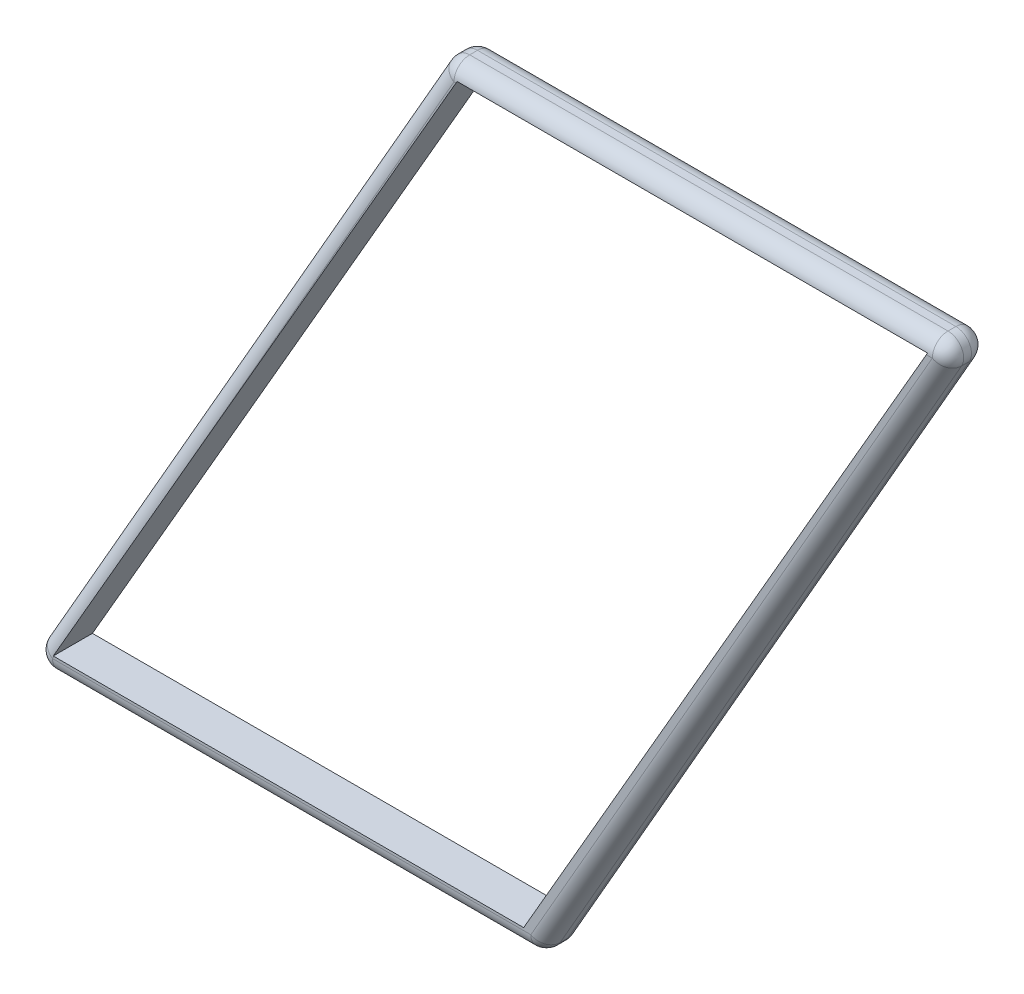
ISO-10303-21;
HEADER;
FILE_DESCRIPTION(('STEP AP214'),'2;1');
FILE_NAME('part.step','',(''),(''),'','','');
FILE_SCHEMA(('AUTOMOTIVE_DESIGN { 1 0 10303 214 1 1 1 1 }'));
ENDSEC;
DATA;
#1=APPLICATION_CONTEXT('core data for automotive mechanical design processes');
#2=APPLICATION_PROTOCOL_DEFINITION('international standard','automotive_design',2000,#1);
#3=PRODUCT_CONTEXT('',#1,'mechanical');
#4=PRODUCT('Part','Part','',(#3));
#5=PRODUCT_RELATED_PRODUCT_CATEGORY('part','',(#4));
#6=PRODUCT_DEFINITION_FORMATION('','',#4);
#7=PRODUCT_DEFINITION_CONTEXT('part definition',#1,'design');
#8=PRODUCT_DEFINITION('design','',#6,#7);
#9=PRODUCT_DEFINITION_SHAPE('','',#8);
#10=(LENGTH_UNIT() NAMED_UNIT(*) SI_UNIT(.MILLI.,.METRE.));
#11=(NAMED_UNIT(*) PLANE_ANGLE_UNIT() SI_UNIT($,.RADIAN.));
#12=(NAMED_UNIT(*) SI_UNIT($,.STERADIAN.) SOLID_ANGLE_UNIT());
#13=UNCERTAINTY_MEASURE_WITH_UNIT(LENGTH_MEASURE(1.E-05),#10,'distance_accuracy_value','');
#14=(GEOMETRIC_REPRESENTATION_CONTEXT(3) GLOBAL_UNCERTAINTY_ASSIGNED_CONTEXT((#13)) GLOBAL_UNIT_ASSIGNED_CONTEXT((#10,
#11,#12)) REPRESENTATION_CONTEXT('',''));
#15=CARTESIAN_POINT('',(0.,0.,0.));
#16=DIRECTION('',(0.,0.,1.));
#17=DIRECTION('',(1.,0.,0.));
#18=AXIS2_PLACEMENT_3D('',#15,#16,#17);
#19=CARTESIAN_POINT('',(0.,0.,-0.025));
#20=DIRECTION('',(0.,0.,-1.));
#21=DIRECTION('',(-1.,0.,0.));
#22=AXIS2_PLACEMENT_3D('',#19,#20,#21);
#23=PLANE('',#22);
#24=DIRECTION('',(0.49749469629556,0.867467017907764,0.));
#25=VECTOR('',#24,1.);
#26=CARTESIAN_POINT('',(0.0458683143982969,-0.459366204679484,-0.025));
#27=LINE('',#26,#25);
#28=CARTESIAN_POINT('',(0.563702430722877,0.443566067772552,-0.025));
#29=VERTEX_POINT('',#28);
#30=CARTESIAN_POINT('',(0.0516320775914222,-0.449316098605395,-0.025));
#31=VERTEX_POINT('',#30);
#32=EDGE_CURVE('E259',#29,#31,#27,.F.);
#33=ORIENTED_EDGE('',*,*,#32,.T.);
#34=DIRECTION('',(1.,0.,0.));
#35=VECTOR('',#34,1.);
#36=CARTESIAN_POINT('',(-0.569917712309587,-0.449316098605395,-0.025));
#37=LINE('',#36,#35);
#38=CARTESIAN_POINT('',(-0.558447657863127,-0.449316098605396,-0.025));
#39=VERTEX_POINT('',#38);
#40=EDGE_CURVE('E11',#31,#39,#37,.F.);
#41=ORIENTED_EDGE('',*,*,#40,.T.);
#42=DIRECTION('',(-0.49749469629556,-0.867467017907764,0.));
#43=VECTOR('',#42,1.);
#44=CARTESIAN_POINT('',(-0.0520835959850074,0.433616173846641,-0.025));
#45=LINE('',#44,#43);
#46=CARTESIAN_POINT('',(-0.556547634365076,-0.446003082948985,-0.025));
#47=VERTEX_POINT('',#46);
#48=EDGE_CURVE('E181',#39,#47,#45,.F.);
#49=ORIENTED_EDGE('',*,*,#48,.T.);
#50=DIRECTION('',(1.,0.,0.));
#51=VECTOR('',#50,1.);
#52=CARTESIAN_POINT('',(-0.557500000000002,-0.446003082948985,-0.025));
#53=LINE('',#52,#51);
#54=CARTESIAN_POINT('',(0.0424999999999978,-0.446003082948985,-0.025));
#55=VERTEX_POINT('',#54);
#56=EDGE_CURVE('E174',#47,#55,#53,.T.);
#57=ORIENTED_EDGE('',*,*,#56,.T.);
#58=DIRECTION('',(0.500000000000004,0.866025403784436,0.));
#59=VECTOR('',#58,1.);
#60=CARTESIAN_POINT('',(0.557500000000002,0.446003082948985,-0.025));
#61=LINE('',#60,#59);
#62=CARTESIAN_POINT('',(0.556092988631869,0.443566067772552,-0.025));
#63=VERTEX_POINT('',#62);
#64=EDGE_CURVE('E178',#55,#63,#61,.T.);
#65=ORIENTED_EDGE('',*,*,#64,.T.);
#66=DIRECTION('',(-1.,0.,0.));
#67=VECTOR('',#66,1.);
#68=CARTESIAN_POINT('',(0.598228116780828,0.443566067772552,-0.025));
#69=LINE('',#68,#67);
#70=EDGE_CURVE('E240',#63,#29,#69,.F.);
#71=ORIENTED_EDGE('',*,*,#70,.T.);
#72=EDGE_LOOP('',(#33,#41,#49,#57,#65,#71));
#73=FACE_BOUND('',#72,.T.);
#74=ADVANCED_FACE('F35',(#73),#23,.T.);
#75=CARTESIAN_POINT('',(0.,0.,0.025));
#76=DIRECTION('',(0.,0.,-1.));
#77=DIRECTION('',(-1.,0.,0.));
#78=AXIS2_PLACEMENT_3D('',#75,#76,#77);
#79=PLANE('',#78);
#80=DIRECTION('',(-1.,0.,0.));
#81=VECTOR('',#80,1.);
#82=CARTESIAN_POINT('',(0.,0.443566067772552,0.025));
#83=LINE('',#82,#81);
#84=CARTESIAN_POINT('',(-0.0439070113681308,0.443566067772552,0.025));
#85=VERTEX_POINT('',#84);
#86=CARTESIAN_POINT('',(-0.0463773047316719,0.443566067772552,0.025));
#87=VERTEX_POINT('',#86);
#88=EDGE_CURVE('E196',#85,#87,#83,.T.);
#89=ORIENTED_EDGE('',*,*,#88,.T.);
#90=DIRECTION('',(-0.49749469629556,-0.867467017907764,0.));
#91=VECTOR('',#90,1.);
#92=CARTESIAN_POINT('',(-0.226324355631767,0.129797634082829,0.025));
#93=LINE('',#92,#91);
#94=CARTESIAN_POINT('',(-0.414591135003143,-0.198477667922426,0.025));
#95=VERTEX_POINT('',#94);
#96=EDGE_CURVE('E276',#87,#95,#93,.T.);
#97=ORIENTED_EDGE('',*,*,#96,.T.);
#98=DIRECTION('',(-0.500000000000004,-0.866025403784436,0.));
#99=VECTOR('',#98,1.);
#100=CARTESIAN_POINT('',(-0.042499999999998,0.446003082948985,0.025));
#101=LINE('',#100,#99);
#102=EDGE_CURVE('E206',#85,#95,#101,.T.);
#103=ORIENTED_EDGE('',*,*,#102,.F.);
#104=EDGE_LOOP('',(#89,#97,#103));
#105=FACE_BOUND('',#104,.T.);
#106=ADVANCED_FACE('F429',(#105),#79,.F.);
#107=CARTESIAN_POINT('',(-0.592973343921078,-0.469316098605395,0.025));
#108=DIRECTION('',(0.867467017907764,-0.49749469629556,0.));
#109=DIRECTION('',(0.49749469629556,0.867467017907764,0.));
#110=AXIS2_PLACEMENT_3D('',#107,#108,#109);
#111=PLANE('',#110);
#112=DIRECTION('',(-0.49749469629556,-0.867467017907764,0.));
#113=VECTOR('',#112,1.);
#114=CARTESIAN_POINT('',(-0.592973343921078,-0.469316098605395,-0.005));
#115=LINE('',#114,#113);
#116=CARTESIAN_POINT('',(-0.0637266450898271,0.453515961698463,-0.005));
#117=VERTEX_POINT('',#116);
#118=CARTESIAN_POINT('',(-0.575796998221282,-0.439366204679484,-0.005));
#119=VERTEX_POINT('',#118);
#120=EDGE_CURVE('E287',#117,#119,#115,.T.);
#121=ORIENTED_EDGE('',*,*,#120,.T.);
#122=DIRECTION('',(0.,0.,-1.));
#123=VECTOR('',#122,1.);
#124=CARTESIAN_POINT('',(-0.575796998221282,-0.439366204679484,0.025));
#125=LINE('',#124,#123);
#126=CARTESIAN_POINT('',(-0.575796998221282,-0.439366204679484,0.005));
#127=VERTEX_POINT('',#126);
#128=EDGE_CURVE('E326',#119,#127,#125,.F.);
#129=ORIENTED_EDGE('',*,*,#128,.T.);
#130=DIRECTION('',(-0.49749469629556,-0.867467017907764,0.));
#131=VECTOR('',#130,1.);
#132=CARTESIAN_POINT('',(-0.592973343921078,-0.469316098605395,0.005));
#133=LINE('',#132,#131);
#134=CARTESIAN_POINT('',(-0.063726645089827,0.453515961698463,0.005));
#135=VERTEX_POINT('',#134);
#136=EDGE_CURVE('E292',#127,#135,#133,.F.);
#137=ORIENTED_EDGE('',*,*,#136,.T.);
#138=DIRECTION('',(0.,0.,-1.));
#139=VECTOR('',#138,1.);
#140=CARTESIAN_POINT('',(-0.063726645089827,0.453515961698463,0.025));
#141=LINE('',#140,#139);
#142=EDGE_CURVE('E290',#135,#117,#141,.T.);
#143=ORIENTED_EDGE('',*,*,#142,.T.);
#144=EDGE_LOOP('',(#121,#129,#137,#143));
#145=FACE_BOUND('',#144,.T.);
#146=ADVANCED_FACE('F435',(#145),#111,.F.);
#147=CARTESIAN_POINT('',(-0.592973343921078,-0.469316098605395,0.025));
#148=DIRECTION('',(0.,1.,0.));
#149=DIRECTION('',(0.,0.,1.));
#150=AXIS2_PLACEMENT_3D('',#147,#148,#149);
#151=PLANE('',#150);
#152=DIRECTION('',(1.,0.,0.));
#153=VECTOR('',#152,1.);
#154=CARTESIAN_POINT('',(-0.592973343921078,-0.469316098605395,0.005));
#155=LINE('',#154,#153);
#156=CARTESIAN_POINT('',(0.0516320775914222,-0.469316098605395,0.005));
#157=VERTEX_POINT('',#156);
#158=CARTESIAN_POINT('',(-0.558447657863126,-0.469316098605395,0.005));
#159=VERTEX_POINT('',#158);
#160=EDGE_CURVE('E321',#157,#159,#155,.F.);
#161=ORIENTED_EDGE('',*,*,#160,.T.);
#162=DIRECTION('',(0.,0.,-1.));
#163=VECTOR('',#162,1.);
#164=CARTESIAN_POINT('',(-0.558447657863126,-0.469316098605395,0.025));
#165=LINE('',#164,#163);
#166=CARTESIAN_POINT('',(-0.558447657863126,-0.469316098605395,-0.005));
#167=VERTEX_POINT('',#166);
#168=EDGE_CURVE('E323',#159,#167,#165,.T.);
#169=ORIENTED_EDGE('',*,*,#168,.T.);
#170=DIRECTION('',(1.,0.,0.));
#171=VECTOR('',#170,1.);
#172=CARTESIAN_POINT('',(0.0401620231449613,-0.469316098605395,-0.005));
#173=LINE('',#172,#171);
#174=CARTESIAN_POINT('',(0.0516320775914222,-0.469316098605395,-0.005));
#175=VERTEX_POINT('',#174);
#176=EDGE_CURVE('E317',#167,#175,#173,.T.);
#177=ORIENTED_EDGE('',*,*,#176,.T.);
#178=DIRECTION('',(0.,0.,-1.));
#179=VECTOR('',#178,1.);
#180=CARTESIAN_POINT('',(0.0516320775914222,-0.469316098605395,0.025));
#181=LINE('',#180,#179);
#182=EDGE_CURVE('E319',#175,#157,#181,.F.);
#183=ORIENTED_EDGE('',*,*,#182,.T.);
#184=EDGE_LOOP('',(#161,#169,#177,#183));
#185=FACE_BOUND('',#184,.T.);
#186=ADVANCED_FACE('F404',(#185),#151,.F.);
#187=CARTESIAN_POINT('',(0.0632176547564521,-0.469316098605395,0.025));
#188=DIRECTION('',(-0.867467017907764,0.49749469629556,0.));
#189=DIRECTION('',(-0.49749469629556,-0.867467017907764,0.));
#190=AXIS2_PLACEMENT_3D('',#187,#188,#189);
#191=PLANE('',#190);
#192=DIRECTION('',(0.49749469629556,0.867467017907764,0.));
#193=VECTOR('',#192,1.);
#194=CARTESIAN_POINT('',(0.0632176547564521,-0.469316098605395,0.005));
#195=LINE('',#194,#193);
#196=CARTESIAN_POINT('',(0.581051771081032,0.433616173846641,0.005));
#197=VERTEX_POINT('',#196);
#198=CARTESIAN_POINT('',(0.0689814179495775,-0.459265992531306,0.005));
#199=VERTEX_POINT('',#198);
#200=EDGE_CURVE('E250',#197,#199,#195,.F.);
#201=ORIENTED_EDGE('',*,*,#200,.T.);
#202=DIRECTION('',(0.,0.,-1.));
#203=VECTOR('',#202,1.);
#204=CARTESIAN_POINT('',(0.0689814179495775,-0.459265992531306,0.025));
#205=LINE('',#204,#203);
#206=CARTESIAN_POINT('',(0.0689814179495774,-0.459265992531307,-0.005));
#207=VERTEX_POINT('',#206);
#208=EDGE_CURVE('E59',#199,#207,#205,.T.);
#209=ORIENTED_EDGE('',*,*,#208,.T.);
#210=DIRECTION('',(0.49749469629556,0.867467017907764,0.));
#211=VECTOR('',#210,1.);
#212=CARTESIAN_POINT('',(0.586758062334367,0.443566067772552,-0.005));
#213=LINE('',#212,#211);
#214=CARTESIAN_POINT('',(0.581051771081032,0.433616173846641,-0.005));
#215=VERTEX_POINT('',#214);
#216=EDGE_CURVE('E246',#207,#215,#213,.T.);
#217=ORIENTED_EDGE('',*,*,#216,.T.);
#218=DIRECTION('',(0.,0.,-1.));
#219=VECTOR('',#218,1.);
#220=CARTESIAN_POINT('',(0.581051771081032,0.433616173846641,0.025));
#221=LINE('',#220,#219);
#222=EDGE_CURVE('E248',#215,#197,#221,.F.);
#223=ORIENTED_EDGE('',*,*,#222,.T.);
#224=EDGE_LOOP('',(#201,#209,#217,#223));
#225=FACE_BOUND('',#224,.T.);
#226=ADVANCED_FACE('F370',(#225),#191,.F.);
#227=CARTESIAN_POINT('',(-0.0579628818967019,0.463566067772552,0.025));
#228=DIRECTION('',(0.,-1.,0.));
#229=DIRECTION('',(0.,0.,-1.));
#230=AXIS2_PLACEMENT_3D('',#227,#228,#229);
#231=PLANE('',#230);
#232=DIRECTION('',(-1.,0.,0.));
#233=VECTOR('',#232,1.);
#234=CARTESIAN_POINT('',(-0.0579628818967019,0.463566067772552,-0.005));
#235=LINE('',#234,#233);
#236=CARTESIAN_POINT('',(0.563702430722877,0.463566067772552,-0.005));
#237=VERTEX_POINT('',#236);
#238=CARTESIAN_POINT('',(-0.0463773047316718,0.463566067772552,-0.005));
#239=VERTEX_POINT('',#238);
#240=EDGE_CURVE('E235',#237,#239,#235,.T.);
#241=ORIENTED_EDGE('',*,*,#240,.T.);
#242=DIRECTION('',(0.,0.,-1.));
#243=VECTOR('',#242,1.);
#244=CARTESIAN_POINT('',(-0.0463773047316718,0.463566067772552,0.025));
#245=LINE('',#244,#243);
#246=CARTESIAN_POINT('',(-0.0463773047316718,0.463566067772552,0.005));
#247=VERTEX_POINT('',#246);
#248=EDGE_CURVE('E296',#239,#247,#245,.F.);
#249=ORIENTED_EDGE('',*,*,#248,.T.);
#250=DIRECTION('',(-1.,0.,0.));
#251=VECTOR('',#250,1.);
#252=CARTESIAN_POINT('',(-0.0579628818967019,0.463566067772552,0.005));
#253=LINE('',#252,#251);
#254=CARTESIAN_POINT('',(0.563702430722877,0.463566067772552,0.005));
#255=VERTEX_POINT('',#254);
#256=EDGE_CURVE('E238',#247,#255,#253,.F.);
#257=ORIENTED_EDGE('',*,*,#256,.T.);
#258=DIRECTION('',(0.,0.,-1.));
#259=VECTOR('',#258,1.);
#260=CARTESIAN_POINT('',(0.563702430722877,0.463566067772552,0.025));
#261=LINE('',#260,#259);
#262=EDGE_CURVE('E255',#255,#237,#261,.T.);
#263=ORIENTED_EDGE('',*,*,#262,.T.);
#264=EDGE_LOOP('',(#241,#249,#257,#263));
#265=FACE_BOUND('',#264,.T.);
#266=ADVANCED_FACE('F446',(#265),#231,.F.);
#267=DIRECTION('',(-0.49749469629556,-0.867467017907764,0.));
#268=VECTOR('',#267,1.);
#269=CARTESIAN_POINT('',(-0.226324355631767,0.129797634082829,0.025));
#270=LINE('',#269,#268);
#271=CARTESIAN_POINT('',(-0.556547634365076,-0.446003082948985,0.025));
#272=VERTEX_POINT('',#271);
#273=CARTESIAN_POINT('',(-0.558447657863127,-0.449316098605395,0.025));
#274=VERTEX_POINT('',#273);
#275=EDGE_CURVE('E261',#272,#274,#270,.T.);
#276=ORIENTED_EDGE('',*,*,#275,.T.);
#277=DIRECTION('',(1.,0.,0.));
#278=VECTOR('',#277,1.);
#279=CARTESIAN_POINT('',(0.,-0.449316098605395,0.025));
#280=LINE('',#279,#278);
#281=CARTESIAN_POINT('',(0.0516320775914221,-0.449316098605395,0.025));
#282=VERTEX_POINT('',#281);
#283=EDGE_CURVE('E330',#274,#282,#280,.T.);
#284=ORIENTED_EDGE('',*,*,#283,.T.);
#285=DIRECTION('',(0.49749469629556,0.867467017907764,0.));
#286=VECTOR('',#285,1.);
#287=CARTESIAN_POINT('',(0.232760051786461,-0.133488523347589,0.025));
#288=LINE('',#287,#286);
#289=CARTESIAN_POINT('',(0.563702430722877,0.443566067772552,0.025));
#290=VERTEX_POINT('',#289);
#291=EDGE_CURVE('E244',#282,#290,#288,.T.);
#292=ORIENTED_EDGE('',*,*,#291,.T.);
#293=DIRECTION('',(-1.,0.,0.));
#294=VECTOR('',#293,1.);
#295=CARTESIAN_POINT('',(0.,0.443566067772552,0.025));
#296=LINE('',#295,#294);
#297=CARTESIAN_POINT('',(0.556092988631869,0.443566067772552,0.025));
#298=VERTEX_POINT('',#297);
#299=EDGE_CURVE('E222',#290,#298,#296,.T.);
#300=ORIENTED_EDGE('',*,*,#299,.T.);
#301=DIRECTION('',(0.500000000000004,0.866025403784436,0.));
#302=VECTOR('',#301,1.);
#303=CARTESIAN_POINT('',(0.557500000000002,0.446003082948985,0.025));
#304=LINE('',#303,#302);
#305=CARTESIAN_POINT('',(0.0424999999999978,-0.446003082948985,0.025));
#306=VERTEX_POINT('',#305);
#307=EDGE_CURVE('E209',#306,#298,#304,.T.);
#308=ORIENTED_EDGE('',*,*,#307,.F.);
#309=DIRECTION('',(1.,0.,0.));
#310=VECTOR('',#309,1.);
#311=CARTESIAN_POINT('',(-0.557500000000002,-0.446003082948985,0.025));
#312=LINE('',#311,#310);
#313=EDGE_CURVE('E192',#272,#306,#312,.T.);
#314=ORIENTED_EDGE('',*,*,#313,.F.);
#315=EDGE_LOOP('',(#276,#284,#292,#300,#308,#314));
#316=FACE_BOUND('',#315,.T.);
#317=ADVANCED_FACE('F387',(#316),#79,.F.);
#318=DIRECTION('',(-0.500000000000004,-0.866025403784436,0.));
#319=VECTOR('',#318,1.);
#320=CARTESIAN_POINT('',(-0.042499999999998,0.446003082948985,-0.025));
#321=LINE('',#320,#319);
#322=CARTESIAN_POINT('',(-0.0439070113681308,0.443566067772552,-0.025));
#323=VERTEX_POINT('',#322);
#324=CARTESIAN_POINT('',(-0.414591135011256,-0.198477667936473,-0.025));
#325=VERTEX_POINT('',#324);
#326=EDGE_CURVE('E185',#323,#325,#321,.T.);
#327=ORIENTED_EDGE('',*,*,#326,.T.);
#328=DIRECTION('',(-0.49749469629556,-0.867467017907764,0.));
#329=VECTOR('',#328,1.);
#330=CARTESIAN_POINT('',(-0.0520835959850074,0.433616173846641,-0.025));
#331=LINE('',#330,#329);
#332=CARTESIAN_POINT('',(-0.0463773047316719,0.443566067772552,-0.025));
#333=VERTEX_POINT('',#332);
#334=EDGE_CURVE('E300',#325,#333,#331,.F.);
#335=ORIENTED_EDGE('',*,*,#334,.T.);
#336=DIRECTION('',(-1.,0.,0.));
#337=VECTOR('',#336,1.);
#338=CARTESIAN_POINT('',(0.598228116780828,0.443566067772552,-0.025));
#339=LINE('',#338,#337);
#340=EDGE_CURVE('E242',#333,#323,#339,.F.);
#341=ORIENTED_EDGE('',*,*,#340,.T.);
#342=EDGE_LOOP('',(#327,#335,#341));
#343=FACE_BOUND('',#342,.T.);
#344=ADVANCED_FACE('F431',(#343),#23,.T.);
#345=CARTESIAN_POINT('',(0.557500000000002,0.446003082948985,-0.025));
#346=DIRECTION('',(0.866025403784436,-0.500000000000004,0.));
#347=DIRECTION('',(0.500000000000004,0.866025403784436,0.));
#348=AXIS2_PLACEMENT_3D('',#345,#346,#347);
#349=PLANE('',#348);
#350=ORIENTED_EDGE('',*,*,#307,.T.);
#351=CARTESIAN_POINT('',(0.556092988631869,0.443566067772552,0.005));
#352=DIRECTION('',(0.866025403784436,-0.500000000000004,0.));
#353=DIRECTION('',(-0.500000000000004,-0.866025403784436,0.));
#354=AXIS2_PLACEMENT_3D('',#351,#352,#353);
#355=ELLIPSE('',#354,0.0230940107675851,0.02);
#356=CARTESIAN_POINT('',(0.557500000000002,0.446003082948985,0.0248509686672927));
#357=VERTEX_POINT('',#356);
#358=EDGE_CURVE('E225',#298,#357,#355,.F.);
#359=ORIENTED_EDGE('',*,*,#358,.T.);
#360=DIRECTION('',(0.,0.,1.));
#361=VECTOR('',#360,1.);
#362=CARTESIAN_POINT('',(0.557500000000002,0.446003082948985,-0.025));
#363=LINE('',#362,#361);
#364=CARTESIAN_POINT('',(0.557500000000002,0.446003082948985,-0.0248509686672927));
#365=VERTEX_POINT('',#364);
#366=EDGE_CURVE('E184',#365,#357,#363,.T.);
#367=ORIENTED_EDGE('',*,*,#366,.F.);
#368=CARTESIAN_POINT('',(0.556092988631869,0.443566067772552,-0.005));
#369=DIRECTION('',(0.866025403784436,-0.500000000000004,0.));
#370=DIRECTION('',(0.500000000000004,0.866025403784436,0.));
#371=AXIS2_PLACEMENT_3D('',#368,#369,#370);
#372=ELLIPSE('',#371,0.0230940107675851,0.02);
#373=EDGE_CURVE('E202',#365,#63,#372,.F.);
#374=ORIENTED_EDGE('',*,*,#373,.T.);
#375=ORIENTED_EDGE('',*,*,#64,.F.);
#376=DIRECTION('',(0.,0.,1.));
#377=VECTOR('',#376,1.);
#378=CARTESIAN_POINT('',(0.0424999999999978,-0.446003082948985,-0.025));
#379=LINE('',#378,#377);
#380=EDGE_CURVE('E188',#55,#306,#379,.T.);
#381=ORIENTED_EDGE('',*,*,#380,.T.);
#382=EDGE_LOOP('',(#350,#359,#367,#374,#375,#381));
#383=FACE_BOUND('',#382,.T.);
#384=ADVANCED_FACE('F199',(#383),#349,.F.);
#385=CARTESIAN_POINT('',(-0.557500000000002,-0.446003082948985,-0.025));
#386=DIRECTION('',(0.,-1.,0.));
#387=DIRECTION('',(0.,0.,-1.));
#388=AXIS2_PLACEMENT_3D('',#385,#386,#387);
#389=PLANE('',#388);
#390=DIRECTION('',(0.,0.,1.));
#391=VECTOR('',#390,1.);
#392=CARTESIAN_POINT('',(-0.557500000000002,-0.446003082948985,-0.025));
#393=LINE('',#392,#391);
#394=CARTESIAN_POINT('',(-0.557500000000002,-0.446003082948985,-0.0249829297940685));
#395=VERTEX_POINT('',#394);
#396=CARTESIAN_POINT('',(-0.557500000000002,-0.446003082948985,0.0249829297940685));
#397=VERTEX_POINT('',#396);
#398=EDGE_CURVE('E197',#395,#397,#393,.T.);
#399=ORIENTED_EDGE('',*,*,#398,.T.);
#400=CARTESIAN_POINT('',(-0.556547634365076,-0.446003082948985,0.005));
#401=DIRECTION('',(0.,-1.,0.));
#402=DIRECTION('',(-1.,0.,0.));
#403=AXIS2_PLACEMENT_3D('',#400,#401,#402);
#404=ELLIPSE('',#403,0.0230556316114909,0.02);
#405=EDGE_CURVE('E285',#397,#272,#404,.F.);
#406=ORIENTED_EDGE('',*,*,#405,.T.);
#407=ORIENTED_EDGE('',*,*,#313,.T.);
#408=ORIENTED_EDGE('',*,*,#380,.F.);
#409=ORIENTED_EDGE('',*,*,#56,.F.);
#410=CARTESIAN_POINT('',(-0.556547634365076,-0.446003082948985,-0.005));
#411=DIRECTION('',(0.,-1.,0.));
#412=DIRECTION('',(1.,0.,0.));
#413=AXIS2_PLACEMENT_3D('',#410,#411,#412);
#414=ELLIPSE('',#413,0.0230556316114909,0.02);
#415=EDGE_CURVE('E283',#47,#395,#414,.F.);
#416=ORIENTED_EDGE('',*,*,#415,.T.);
#417=EDGE_LOOP('',(#399,#406,#407,#408,#409,#416));
#418=FACE_BOUND('',#417,.T.);
#419=ADVANCED_FACE('F190',(#418),#389,.F.);
#420=CARTESIAN_POINT('',(-0.042499999999998,0.446003082948985,-0.025));
#421=DIRECTION('',(-0.866025403784436,0.500000000000004,0.));
#422=DIRECTION('',(-0.500000000000004,-0.866025403784436,0.));
#423=AXIS2_PLACEMENT_3D('',#420,#421,#422);
#424=PLANE('',#423);
#425=ORIENTED_EDGE('',*,*,#102,.T.);
#426=CARTESIAN_POINT('',(-0.414591135011999,-0.198477667937764,0.005));
#427=DIRECTION('',(-0.866025403784436,0.500000000000004,0.));
#428=DIRECTION('',(-0.500000000000004,-0.866025403784436,0.));
#429=AXIS2_PLACEMENT_3D('',#426,#427,#428);
#430=ELLIPSE('',#429,6.91930499032752,0.02);
#431=EDGE_CURVE('E281',#95,#397,#430,.F.);
#432=ORIENTED_EDGE('',*,*,#431,.T.);
#433=ORIENTED_EDGE('',*,*,#398,.F.);
#434=CARTESIAN_POINT('',(-0.414591135012008,-0.198477667937781,-0.005));
#435=DIRECTION('',(-0.866025403784436,0.500000000000004,0.));
#436=DIRECTION('',(0.500000000000004,0.866025403784436,0.));
#437=AXIS2_PLACEMENT_3D('',#434,#435,#436);
#438=ELLIPSE('',#437,6.91930499032752,0.02);
#439=EDGE_CURVE('E279',#395,#325,#438,.F.);
#440=ORIENTED_EDGE('',*,*,#439,.T.);
#441=ORIENTED_EDGE('',*,*,#326,.F.);
#442=CARTESIAN_POINT('',(-0.0439070113681308,0.443566067772552,-0.005));
#443=DIRECTION('',(-0.866025403784436,0.500000000000004,0.));
#444=DIRECTION('',(0.500000000000004,0.866025403784436,0.));
#445=AXIS2_PLACEMENT_3D('',#442,#443,#444);
#446=ELLIPSE('',#445,0.0230940107675851,0.02);
#447=CARTESIAN_POINT('',(-0.042499999999998,0.446003082948985,-0.0248509686672927));
#448=VERTEX_POINT('',#447);
#449=EDGE_CURVE('E231',#323,#448,#446,.F.);
#450=ORIENTED_EDGE('',*,*,#449,.T.);
#451=DIRECTION('',(0.,0.,1.));
#452=VECTOR('',#451,1.);
#453=CARTESIAN_POINT('',(-0.042499999999998,0.446003082948985,-0.025));
#454=LINE('',#453,#452);
#455=CARTESIAN_POINT('',(-0.042499999999998,0.446003082948985,0.0248509686672927));
#456=VERTEX_POINT('',#455);
#457=EDGE_CURVE('E215',#448,#456,#454,.T.);
#458=ORIENTED_EDGE('',*,*,#457,.T.);
#459=CARTESIAN_POINT('',(-0.0439070113681308,0.443566067772552,0.005));
#460=DIRECTION('',(-0.866025403784436,0.500000000000004,0.));
#461=DIRECTION('',(-0.500000000000004,-0.866025403784436,0.));
#462=AXIS2_PLACEMENT_3D('',#459,#460,#461);
#463=ELLIPSE('',#462,0.0230940107675851,0.02);
#464=EDGE_CURVE('E233',#456,#85,#463,.F.);
#465=ORIENTED_EDGE('',*,*,#464,.T.);
#466=EDGE_LOOP('',(#425,#432,#433,#440,#441,#450,#458,#465));
#467=FACE_BOUND('',#466,.T.);
#468=ADVANCED_FACE('F474',(#467),#424,.F.);
#469=CARTESIAN_POINT('',(-0.042499999999998,0.446003082948985,-0.025));
#470=DIRECTION('',(0.,1.,0.));
#471=DIRECTION('',(0.,0.,1.));
#472=AXIS2_PLACEMENT_3D('',#469,#470,#471);
#473=PLANE('',#472);
#474=ORIENTED_EDGE('',*,*,#366,.T.);
#475=DIRECTION('',(-1.,0.,0.));
#476=VECTOR('',#475,1.);
#477=CARTESIAN_POINT('',(0.557500000000002,0.446003082948985,0.0248509686672927));
#478=LINE('',#477,#476);
#479=EDGE_CURVE('E229',#357,#456,#478,.T.);
#480=ORIENTED_EDGE('',*,*,#479,.T.);
#481=ORIENTED_EDGE('',*,*,#457,.F.);
#482=DIRECTION('',(1.,0.,0.));
#483=VECTOR('',#482,1.);
#484=CARTESIAN_POINT('',(-0.042499999999998,0.446003082948985,-0.0248509686672927));
#485=LINE('',#484,#483);
#486=EDGE_CURVE('E227',#448,#365,#485,.T.);
#487=ORIENTED_EDGE('',*,*,#486,.T.);
#488=EDGE_LOOP('',(#474,#480,#481,#487));
#489=FACE_BOUND('',#488,.T.);
#490=ADVANCED_FACE('F479',(#489),#473,.F.);
#491=CARTESIAN_POINT('',(0.,0.443566067772552,0.005));
#492=DIRECTION('',(-1.,0.,0.));
#493=DIRECTION('',(0.,0.,1.));
#494=AXIS2_PLACEMENT_3D('',#491,#492,#493);
#495=CYLINDRICAL_SURFACE('',#494,0.02);
#496=ORIENTED_EDGE('',*,*,#256,.F.);
#497=CARTESIAN_POINT('',(-0.0463773047316719,0.443566067772552,0.005));
#498=DIRECTION('',(-1.,0.,0.));
#499=DIRECTION('',(0.,0.,1.));
#500=AXIS2_PLACEMENT_3D('',#497,#498,#499);
#501=CIRCLE('',#500,0.02);
#502=EDGE_CURVE('E294',#247,#87,#501,.F.);
#503=ORIENTED_EDGE('',*,*,#502,.T.);
#504=ORIENTED_EDGE('',*,*,#88,.F.);
#505=ORIENTED_EDGE('',*,*,#464,.F.);
#506=ORIENTED_EDGE('',*,*,#479,.F.);
#507=ORIENTED_EDGE('',*,*,#358,.F.);
#508=ORIENTED_EDGE('',*,*,#299,.F.);
#509=CARTESIAN_POINT('',(0.563702430722877,0.443566067772552,0.005));
#510=DIRECTION('',(-1.,0.,0.));
#511=DIRECTION('',(0.,0.,1.));
#512=AXIS2_PLACEMENT_3D('',#509,#510,#511);
#513=CIRCLE('',#512,0.02);
#514=EDGE_CURVE('E252',#290,#255,#513,.T.);
#515=ORIENTED_EDGE('',*,*,#514,.T.);
#516=EDGE_LOOP('',(#496,#503,#504,#505,#506,#507,#508,#515));
#517=FACE_BOUND('',#516,.T.);
#518=ADVANCED_FACE('F384',(#517),#495,.T.);
#519=CARTESIAN_POINT('',(-0.0579628818967019,0.443566067772552,-0.005));
#520=DIRECTION('',(1.,0.,0.));
#521=DIRECTION('',(0.,0.,-1.));
#522=AXIS2_PLACEMENT_3D('',#519,#520,#521);
#523=CYLINDRICAL_SURFACE('',#522,0.02);
#524=ORIENTED_EDGE('',*,*,#340,.F.);
#525=CARTESIAN_POINT('',(-0.0463773047316718,0.443566067772552,-0.005));
#526=DIRECTION('',(1.,0.,0.));
#527=DIRECTION('',(0.,0.,-1.));
#528=AXIS2_PLACEMENT_3D('',#525,#526,#527);
#529=CIRCLE('',#528,0.02);
#530=EDGE_CURVE('E298',#333,#239,#529,.T.);
#531=ORIENTED_EDGE('',*,*,#530,.T.);
#532=ORIENTED_EDGE('',*,*,#240,.F.);
#533=CARTESIAN_POINT('',(0.563702430722877,0.443566067772552,-0.005));
#534=DIRECTION('',(1.,0.,0.));
#535=DIRECTION('',(0.,0.,-1.));
#536=AXIS2_PLACEMENT_3D('',#533,#534,#535);
#537=CIRCLE('',#536,0.02);
#538=EDGE_CURVE('E257',#237,#29,#537,.F.);
#539=ORIENTED_EDGE('',*,*,#538,.T.);
#540=ORIENTED_EDGE('',*,*,#70,.F.);
#541=ORIENTED_EDGE('',*,*,#373,.F.);
#542=ORIENTED_EDGE('',*,*,#486,.F.);
#543=ORIENTED_EDGE('',*,*,#449,.F.);
#544=EDGE_LOOP('',(#524,#531,#532,#539,#540,#541,#542,#543));
#545=FACE_BOUND('',#544,.T.);
#546=ADVANCED_FACE('F460',(#545),#523,.T.);
#547=CARTESIAN_POINT('',(0.0458683143982969,-0.459366204679484,-0.005));
#548=DIRECTION('',(-0.49749469629556,-0.867467017907764,0.));
#549=DIRECTION('',(0.867467017907764,-0.49749469629556,0.));
#550=AXIS2_PLACEMENT_3D('',#547,#548,#549);
#551=CYLINDRICAL_SURFACE('',#550,0.02);
#552=ORIENTED_EDGE('',*,*,#216,.F.);
#553=CARTESIAN_POINT('',(0.0516320775914222,-0.449316098605395,-0.005));
#554=DIRECTION('',(-0.49749469629556,-0.867467017907764,0.));
#555=DIRECTION('',(0.867467017907764,-0.49749469629556,0.));
#556=AXIS2_PLACEMENT_3D('',#553,#554,#555);
#557=CIRCLE('',#556,0.02);
#558=EDGE_CURVE('E44',#207,#31,#557,.F.);
#559=ORIENTED_EDGE('',*,*,#558,.T.);
#560=ORIENTED_EDGE('',*,*,#32,.F.);
#561=CARTESIAN_POINT('',(0.563702430722877,0.443566067772552,-0.005));
#562=DIRECTION('',(0.497494696295561,0.867467017907763,0.));
#563=DIRECTION('',(-0.867467017907763,0.497494696295561,0.));
#564=AXIS2_PLACEMENT_3D('',#561,#562,#563);
#565=CIRCLE('',#564,0.02);
#566=EDGE_CURVE('E211',#215,#29,#565,.T.);
#567=ORIENTED_EDGE('',*,*,#566,.F.);
#568=EDGE_LOOP('',(#552,#559,#560,#567));
#569=FACE_BOUND('',#568,.T.);
#570=ADVANCED_FACE('F481',(#569),#551,.T.);
#571=CARTESIAN_POINT('',(0.563702430722877,0.443566067772552,-0.005));
#572=DIRECTION('',(-0.867467017907764,0.49749469629556,0.));
#573=DIRECTION('',(-0.49749469629556,-0.867467017907764,0.));
#574=AXIS2_PLACEMENT_3D('',#571,#572,#573);
#575=SPHERICAL_SURFACE('',#574,0.02);
#576=ORIENTED_EDGE('',*,*,#566,.T.);
#577=ORIENTED_EDGE('',*,*,#538,.F.);
#578=CARTESIAN_POINT('',(0.563702430722877,0.443566067772552,-0.005));
#579=DIRECTION('',(0.,0.,1.));
#580=DIRECTION('',(1.,0.,0.));
#581=AXIS2_PLACEMENT_3D('',#578,#579,#580);
#582=CIRCLE('',#581,0.02);
#583=EDGE_CURVE('E269',#215,#237,#582,.T.);
#584=ORIENTED_EDGE('',*,*,#583,.F.);
#585=EDGE_LOOP('',(#576,#577,#584));
#586=FACE_BOUND('',#585,.T.);
#587=ADVANCED_FACE('F484',(#586),#575,.T.);
#588=CARTESIAN_POINT('',(0.563702430722877,0.443566067772552,0.025));
#589=DIRECTION('',(0.,0.,-1.));
#590=DIRECTION('',(-1.,0.,0.));
#591=AXIS2_PLACEMENT_3D('',#588,#589,#590);
#592=CYLINDRICAL_SURFACE('',#591,0.02);
#593=ORIENTED_EDGE('',*,*,#583,.T.);
#594=ORIENTED_EDGE('',*,*,#262,.F.);
#595=CARTESIAN_POINT('',(0.563702430722877,0.443566067772552,0.005));
#596=DIRECTION('',(0.,0.,1.));
#597=DIRECTION('',(1.,0.,0.));
#598=AXIS2_PLACEMENT_3D('',#595,#596,#597);
#599=CIRCLE('',#598,0.02);
#600=EDGE_CURVE('E265',#197,#255,#599,.T.);
#601=ORIENTED_EDGE('',*,*,#600,.F.);
#602=ORIENTED_EDGE('',*,*,#222,.F.);
#603=EDGE_LOOP('',(#593,#594,#601,#602));
#604=FACE_BOUND('',#603,.T.);
#605=ADVANCED_FACE('F376',(#604),#592,.T.);
#606=CARTESIAN_POINT('',(0.563702430722877,0.443566067772552,0.005));
#607=DIRECTION('',(-0.867467017907764,0.49749469629556,0.));
#608=DIRECTION('',(-0.49749469629556,-0.867467017907764,0.));
#609=AXIS2_PLACEMENT_3D('',#606,#607,#608);
#610=SPHERICAL_SURFACE('',#609,0.02);
#611=ORIENTED_EDGE('',*,*,#600,.T.);
#612=ORIENTED_EDGE('',*,*,#514,.F.);
#613=CARTESIAN_POINT('',(0.563702430722877,0.443566067772552,0.005));
#614=DIRECTION('',(-0.497494696295561,-0.867467017907763,0.));
#615=DIRECTION('',(0.867467017907763,-0.497494696295561,0.));
#616=AXIS2_PLACEMENT_3D('',#613,#614,#615);
#617=CIRCLE('',#616,0.02);
#618=EDGE_CURVE('E262',#197,#290,#617,.T.);
#619=ORIENTED_EDGE('',*,*,#618,.F.);
#620=EDGE_LOOP('',(#611,#612,#619));
#621=FACE_BOUND('',#620,.T.);
#622=ADVANCED_FACE('F379',(#621),#610,.T.);
#623=CARTESIAN_POINT('',(0.232760051786461,-0.13348852334759,0.005));
#624=DIRECTION('',(0.49749469629556,0.867467017907764,0.));
#625=DIRECTION('',(-0.867467017907764,0.49749469629556,0.));
#626=AXIS2_PLACEMENT_3D('',#623,#624,#625);
#627=CYLINDRICAL_SURFACE('',#626,0.02);
#628=ORIENTED_EDGE('',*,*,#291,.F.);
#629=CARTESIAN_POINT('',(0.0516320775914222,-0.449316098605395,0.005));
#630=DIRECTION('',(0.49749469629556,0.867467017907764,0.));
#631=DIRECTION('',(-0.867467017907764,0.49749469629556,0.));
#632=AXIS2_PLACEMENT_3D('',#629,#630,#631);
#633=CIRCLE('',#632,0.02);
#634=EDGE_CURVE('E332',#282,#199,#633,.T.);
#635=ORIENTED_EDGE('',*,*,#634,.T.);
#636=ORIENTED_EDGE('',*,*,#200,.F.);
#637=ORIENTED_EDGE('',*,*,#618,.T.);
#638=EDGE_LOOP('',(#628,#635,#636,#637));
#639=FACE_BOUND('',#638,.T.);
#640=ADVANCED_FACE('F368',(#639),#627,.T.);
#641=CARTESIAN_POINT('',(-0.575624003562923,-0.479265992531306,-0.005));
#642=DIRECTION('',(0.49749469629556,0.867467017907764,0.));
#643=DIRECTION('',(-0.867467017907764,0.49749469629556,0.));
#644=AXIS2_PLACEMENT_3D('',#641,#642,#643);
#645=CYLINDRICAL_SURFACE('',#644,0.02);
#646=ORIENTED_EDGE('',*,*,#48,.F.);
#647=CARTESIAN_POINT('',(-0.558447657863126,-0.449316098605395,-0.005));
#648=DIRECTION('',(0.49749469629556,0.867467017907764,0.));
#649=DIRECTION('',(-0.867467017907764,0.49749469629556,0.));
#650=AXIS2_PLACEMENT_3D('',#647,#648,#649);
#651=CIRCLE('',#650,0.02);
#652=EDGE_CURVE('E303',#39,#119,#651,.T.);
#653=ORIENTED_EDGE('',*,*,#652,.T.);
#654=ORIENTED_EDGE('',*,*,#120,.F.);
#655=CARTESIAN_POINT('',(-0.0463773047316718,0.443566067772552,-0.005));
#656=DIRECTION('',(0.49749469629556,0.867467017907764,0.));
#657=DIRECTION('',(-0.867467017907764,0.49749469629556,0.));
#658=AXIS2_PLACEMENT_3D('',#655,#656,#657);
#659=CIRCLE('',#658,0.02);
#660=EDGE_CURVE('E266',#333,#117,#659,.T.);
#661=ORIENTED_EDGE('',*,*,#660,.F.);
#662=ORIENTED_EDGE('',*,*,#334,.F.);
#663=ORIENTED_EDGE('',*,*,#439,.F.);
#664=ORIENTED_EDGE('',*,*,#415,.F.);
#665=EDGE_LOOP('',(#646,#653,#654,#661,#662,#663,#664));
#666=FACE_BOUND('',#665,.T.);
#667=ADVANCED_FACE('F416',(#666),#645,.T.);
#668=CARTESIAN_POINT('',(-0.0463773047316718,0.443566067772552,-0.005));
#669=DIRECTION('',(0.867467017907764,-0.49749469629556,0.));
#670=DIRECTION('',(0.49749469629556,0.867467017907764,0.));
#671=AXIS2_PLACEMENT_3D('',#668,#669,#670);
#672=SPHERICAL_SURFACE('',#671,0.02);
#673=ORIENTED_EDGE('',*,*,#530,.F.);
#674=ORIENTED_EDGE('',*,*,#660,.T.);
#675=CARTESIAN_POINT('',(-0.0463773047316718,0.443566067772552,-0.005));
#676=DIRECTION('',(0.,0.,1.));
#677=DIRECTION('',(1.,0.,0.));
#678=AXIS2_PLACEMENT_3D('',#675,#676,#677);
#679=CIRCLE('',#678,0.02);
#680=EDGE_CURVE('E310',#239,#117,#679,.T.);
#681=ORIENTED_EDGE('',*,*,#680,.F.);
#682=EDGE_LOOP('',(#673,#674,#681));
#683=FACE_BOUND('',#682,.T.);
#684=ADVANCED_FACE('F456',(#683),#672,.T.);
#685=CARTESIAN_POINT('',(-0.0463773047316718,0.443566067772552,0.025));
#686=DIRECTION('',(0.,0.,-1.));
#687=DIRECTION('',(-1.,0.,0.));
#688=AXIS2_PLACEMENT_3D('',#685,#686,#687);
#689=CYLINDRICAL_SURFACE('',#688,0.02);
#690=CARTESIAN_POINT('',(-0.0463773047316718,0.443566067772552,0.005));
#691=DIRECTION('',(0.,0.,1.));
#692=DIRECTION('',(1.,0.,0.));
#693=AXIS2_PLACEMENT_3D('',#690,#691,#692);
#694=CIRCLE('',#693,0.02);
#695=EDGE_CURVE('E307',#247,#135,#694,.T.);
#696=ORIENTED_EDGE('',*,*,#695,.F.);
#697=ORIENTED_EDGE('',*,*,#248,.F.);
#698=ORIENTED_EDGE('',*,*,#680,.T.);
#699=ORIENTED_EDGE('',*,*,#142,.F.);
#700=EDGE_LOOP('',(#696,#697,#698,#699));
#701=FACE_BOUND('',#700,.T.);
#702=ADVANCED_FACE('F468',(#701),#689,.T.);
#703=CARTESIAN_POINT('',(-0.0463773047316719,0.443566067772552,0.005));
#704=DIRECTION('',(0.867467017907764,-0.49749469629556,0.));
#705=DIRECTION('',(0.49749469629556,0.867467017907764,0.));
#706=AXIS2_PLACEMENT_3D('',#703,#704,#705);
#707=SPHERICAL_SURFACE('',#706,0.02);
#708=ORIENTED_EDGE('',*,*,#502,.F.);
#709=ORIENTED_EDGE('',*,*,#695,.T.);
#710=CARTESIAN_POINT('',(-0.0463773047316719,0.443566067772552,0.005));
#711=DIRECTION('',(-0.497494696295561,-0.867467017907763,0.));
#712=DIRECTION('',(0.867467017907763,-0.497494696295561,0.));
#713=AXIS2_PLACEMENT_3D('',#710,#711,#712);
#714=CIRCLE('',#713,0.02);
#715=EDGE_CURVE('E304',#87,#135,#714,.T.);
#716=ORIENTED_EDGE('',*,*,#715,.F.);
#717=EDGE_LOOP('',(#708,#709,#716));
#718=FACE_BOUND('',#717,.T.);
#719=ADVANCED_FACE('F471',(#718),#707,.T.);
#720=CARTESIAN_POINT('',(-0.226324355631767,0.129797634082829,0.005));
#721=DIRECTION('',(-0.49749469629556,-0.867467017907764,0.));
#722=DIRECTION('',(0.867467017907764,-0.49749469629556,0.));
#723=AXIS2_PLACEMENT_3D('',#720,#721,#722);
#724=CYLINDRICAL_SURFACE('',#723,0.02);
#725=ORIENTED_EDGE('',*,*,#136,.F.);
#726=CARTESIAN_POINT('',(-0.558447657863126,-0.449316098605395,0.005));
#727=DIRECTION('',(-0.49749469629556,-0.867467017907764,0.));
#728=DIRECTION('',(0.867467017907764,-0.49749469629556,0.));
#729=AXIS2_PLACEMENT_3D('',#726,#727,#728);
#730=CIRCLE('',#729,0.02);
#731=EDGE_CURVE('E328',#127,#274,#730,.F.);
#732=ORIENTED_EDGE('',*,*,#731,.T.);
#733=ORIENTED_EDGE('',*,*,#275,.F.);
#734=ORIENTED_EDGE('',*,*,#405,.F.);
#735=ORIENTED_EDGE('',*,*,#431,.F.);
#736=ORIENTED_EDGE('',*,*,#96,.F.);
#737=ORIENTED_EDGE('',*,*,#715,.T.);
#738=EDGE_LOOP('',(#725,#732,#733,#734,#735,#736,#737));
#739=FACE_BOUND('',#738,.T.);
#740=ADVANCED_FACE('F392',(#739),#724,.T.);
#741=CARTESIAN_POINT('',(0.0516320775914222,-0.449316098605395,0.005));
#742=DIRECTION('',(0.,1.,0.));
#743=DIRECTION('',(0.,0.,1.));
#744=AXIS2_PLACEMENT_3D('',#741,#742,#743);
#745=SPHERICAL_SURFACE('',#744,0.02);
#746=CARTESIAN_POINT('',(0.0516320775914222,-0.449316098605395,0.005));
#747=DIRECTION('',(0.,0.,-1.));
#748=DIRECTION('',(-1.,0.,0.));
#749=AXIS2_PLACEMENT_3D('',#746,#747,#748);
#750=CIRCLE('',#749,0.02);
#751=EDGE_CURVE('E351',#199,#157,#750,.T.);
#752=ORIENTED_EDGE('',*,*,#751,.F.);
#753=ORIENTED_EDGE('',*,*,#634,.F.);
#754=CARTESIAN_POINT('',(0.0516320775914222,-0.449316098605395,0.005));
#755=DIRECTION('',(-1.,0.,0.));
#756=DIRECTION('',(0.,0.,1.));
#757=AXIS2_PLACEMENT_3D('',#754,#755,#756);
#758=CIRCLE('',#757,0.02);
#759=EDGE_CURVE('E39',#157,#282,#758,.T.);
#760=ORIENTED_EDGE('',*,*,#759,.F.);
#761=EDGE_LOOP('',(#752,#753,#760));
#762=FACE_BOUND('',#761,.T.);
#763=ADVANCED_FACE('F37',(#762),#745,.T.);
#764=CARTESIAN_POINT('',(0.,-0.449316098605395,0.005));
#765=DIRECTION('',(1.,0.,0.));
#766=DIRECTION('',(0.,0.,-1.));
#767=AXIS2_PLACEMENT_3D('',#764,#765,#766);
#768=CYLINDRICAL_SURFACE('',#767,0.02);
#769=ORIENTED_EDGE('',*,*,#759,.T.);
#770=ORIENTED_EDGE('',*,*,#283,.F.);
#771=CARTESIAN_POINT('',(-0.558447657863126,-0.449316098605395,0.005));
#772=DIRECTION('',(-1.,0.,0.));
#773=DIRECTION('',(0.,0.,1.));
#774=AXIS2_PLACEMENT_3D('',#771,#772,#773);
#775=CIRCLE('',#774,0.02);
#776=EDGE_CURVE('E349',#159,#274,#775,.T.);
#777=ORIENTED_EDGE('',*,*,#776,.F.);
#778=ORIENTED_EDGE('',*,*,#160,.F.);
#779=EDGE_LOOP('',(#769,#770,#777,#778));
#780=FACE_BOUND('',#779,.T.);
#781=ADVANCED_FACE('F361',(#780),#768,.T.);
#782=CARTESIAN_POINT('',(0.0516320775914222,-0.449316098605395,0.025));
#783=DIRECTION('',(0.,0.,-1.));
#784=DIRECTION('',(-1.,0.,0.));
#785=AXIS2_PLACEMENT_3D('',#782,#783,#784);
#786=CYLINDRICAL_SURFACE('',#785,0.02);
#787=ORIENTED_EDGE('',*,*,#751,.T.);
#788=ORIENTED_EDGE('',*,*,#182,.F.);
#789=CARTESIAN_POINT('',(0.0516320775914222,-0.449316098605395,-0.005));
#790=DIRECTION('',(0.,0.,-1.));
#791=DIRECTION('',(-1.,0.,0.));
#792=AXIS2_PLACEMENT_3D('',#789,#790,#791);
#793=CIRCLE('',#792,0.02);
#794=EDGE_CURVE('E346',#207,#175,#793,.T.);
#795=ORIENTED_EDGE('',*,*,#794,.F.);
#796=ORIENTED_EDGE('',*,*,#208,.F.);
#797=EDGE_LOOP('',(#787,#788,#795,#796));
#798=FACE_BOUND('',#797,.T.);
#799=ADVANCED_FACE('F406',(#798),#786,.T.);
#800=CARTESIAN_POINT('',(-0.558447657863126,-0.449316098605395,0.005));
#801=DIRECTION('',(0.,1.,0.));
#802=DIRECTION('',(0.,0.,1.));
#803=AXIS2_PLACEMENT_3D('',#800,#801,#802);
#804=SPHERICAL_SURFACE('',#803,0.02);
#805=ORIENTED_EDGE('',*,*,#776,.T.);
#806=ORIENTED_EDGE('',*,*,#731,.F.);
#807=CARTESIAN_POINT('',(-0.558447657863126,-0.449316098605395,0.005));
#808=DIRECTION('',(0.,0.,-1.));
#809=DIRECTION('',(-1.,0.,0.));
#810=AXIS2_PLACEMENT_3D('',#807,#808,#809);
#811=CIRCLE('',#810,0.02);
#812=EDGE_CURVE('E343',#159,#127,#811,.T.);
#813=ORIENTED_EDGE('',*,*,#812,.F.);
#814=EDGE_LOOP('',(#805,#806,#813));
#815=FACE_BOUND('',#814,.T.);
#816=ADVANCED_FACE('F396',(#815),#804,.T.);
#817=CARTESIAN_POINT('',(0.0516320775914222,-0.449316098605395,-0.005));
#818=DIRECTION('',(0.,1.,0.));
#819=DIRECTION('',(0.,0.,1.));
#820=AXIS2_PLACEMENT_3D('',#817,#818,#819);
#821=SPHERICAL_SURFACE('',#820,0.02);
#822=ORIENTED_EDGE('',*,*,#558,.F.);
#823=ORIENTED_EDGE('',*,*,#794,.T.);
#824=CARTESIAN_POINT('',(0.0516320775914222,-0.449316098605395,-0.005));
#825=DIRECTION('',(-1.,0.,0.));
#826=DIRECTION('',(0.,-1.,0.));
#827=AXIS2_PLACEMENT_3D('',#824,#825,#826);
#828=CIRCLE('',#827,0.02);
#829=EDGE_CURVE('E340',#31,#175,#828,.T.);
#830=ORIENTED_EDGE('',*,*,#829,.F.);
#831=EDGE_LOOP('',(#822,#823,#830));
#832=FACE_BOUND('',#831,.T.);
#833=ADVANCED_FACE('F409',(#832),#821,.T.);
#834=CARTESIAN_POINT('',(-0.558447657863126,-0.449316098605395,0.025));
#835=DIRECTION('',(0.,0.,-1.));
#836=DIRECTION('',(-1.,0.,0.));
#837=AXIS2_PLACEMENT_3D('',#834,#835,#836);
#838=CYLINDRICAL_SURFACE('',#837,0.02);
#839=ORIENTED_EDGE('',*,*,#812,.T.);
#840=ORIENTED_EDGE('',*,*,#128,.F.);
#841=CARTESIAN_POINT('',(-0.558447657863126,-0.449316098605395,-0.005));
#842=DIRECTION('',(0.,0.,-1.));
#843=DIRECTION('',(-1.,0.,0.));
#844=AXIS2_PLACEMENT_3D('',#841,#842,#843);
#845=CIRCLE('',#844,0.02);
#846=EDGE_CURVE('E338',#167,#119,#845,.T.);
#847=ORIENTED_EDGE('',*,*,#846,.F.);
#848=ORIENTED_EDGE('',*,*,#168,.F.);
#849=EDGE_LOOP('',(#839,#840,#847,#848));
#850=FACE_BOUND('',#849,.T.);
#851=ADVANCED_FACE('F400',(#850),#838,.T.);
#852=CARTESIAN_POINT('',(-0.592973343921078,-0.449316098605395,-0.005));
#853=DIRECTION('',(-1.,0.,0.));
#854=DIRECTION('',(0.,0.,1.));
#855=AXIS2_PLACEMENT_3D('',#852,#853,#854);
#856=CYLINDRICAL_SURFACE('',#855,0.02);
#857=ORIENTED_EDGE('',*,*,#829,.T.);
#858=ORIENTED_EDGE('',*,*,#176,.F.);
#859=CARTESIAN_POINT('',(-0.558447657863126,-0.449316098605395,-0.005));
#860=DIRECTION('',(-1.,0.,0.));
#861=DIRECTION('',(0.,0.,1.));
#862=AXIS2_PLACEMENT_3D('',#859,#860,#861);
#863=CIRCLE('',#862,0.02);
#864=EDGE_CURVE('E336',#39,#167,#863,.T.);
#865=ORIENTED_EDGE('',*,*,#864,.F.);
#866=ORIENTED_EDGE('',*,*,#40,.F.);
#867=EDGE_LOOP('',(#857,#858,#865,#866));
#868=FACE_BOUND('',#867,.T.);
#869=ADVANCED_FACE('F412',(#868),#856,.T.);
#870=CARTESIAN_POINT('',(-0.558447657863126,-0.449316098605395,-0.005));
#871=DIRECTION('',(0.,1.,0.));
#872=DIRECTION('',(0.,0.,1.));
#873=AXIS2_PLACEMENT_3D('',#870,#871,#872);
#874=SPHERICAL_SURFACE('',#873,0.02);
#875=ORIENTED_EDGE('',*,*,#846,.T.);
#876=ORIENTED_EDGE('',*,*,#652,.F.);
#877=ORIENTED_EDGE('',*,*,#864,.T.);
#878=EDGE_LOOP('',(#875,#876,#877));
#879=FACE_BOUND('',#878,.T.);
#880=ADVANCED_FACE('F420',(#879),#874,.T.);
#881=CLOSED_SHELL('',(#74,#106,#146,#186,#226,#266,#317,#344,#384,#419,#468,#490,#518,#546,#570,
#587,#605,#622,#640,#667,#684,#702,#719,#740,#763,#781,#799,#816,#833,#851,#869,#880));
#882=MANIFOLD_SOLID_BREP('B2',#881);
#883=ADVANCED_BREP_SHAPE_REPRESENTATION('',(#18,#882),#14);
#884=SHAPE_DEFINITION_REPRESENTATION(#9,#883);
ENDSEC;
END-ISO-10303-21;
